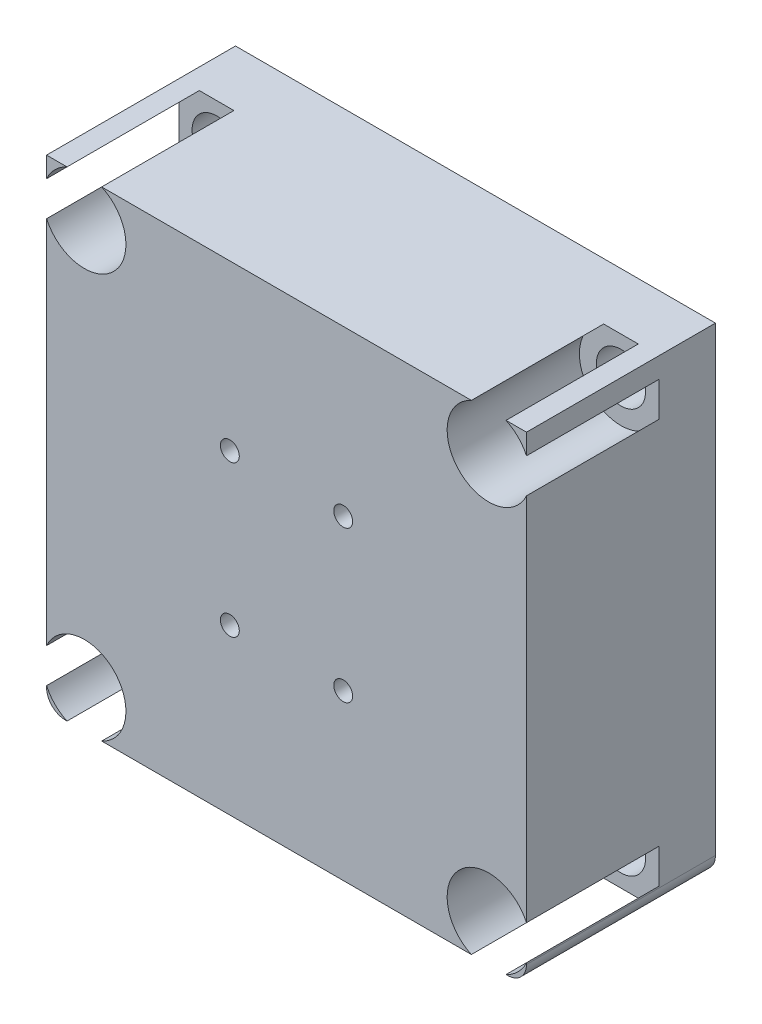
ISO-10303-21;
HEADER;
FILE_DESCRIPTION(('STEP AP214'),'2;1');
FILE_NAME('part.step','',(''),(''),'','','');
FILE_SCHEMA(('AUTOMOTIVE_DESIGN { 1 0 10303 214 1 1 1 1 }'));
ENDSEC;
DATA;
#1=APPLICATION_CONTEXT('core data for automotive mechanical design processes');
#2=APPLICATION_PROTOCOL_DEFINITION('international standard','automotive_design',2000,#1);
#3=PRODUCT_CONTEXT('',#1,'mechanical');
#4=PRODUCT('Part','Part','',(#3));
#5=PRODUCT_RELATED_PRODUCT_CATEGORY('part','',(#4));
#6=PRODUCT_DEFINITION_FORMATION('','',#4);
#7=PRODUCT_DEFINITION_CONTEXT('part definition',#1,'design');
#8=PRODUCT_DEFINITION('design','',#6,#7);
#9=PRODUCT_DEFINITION_SHAPE('','',#8);
#10=(LENGTH_UNIT() NAMED_UNIT(*) SI_UNIT(.MILLI.,.METRE.));
#11=(NAMED_UNIT(*) PLANE_ANGLE_UNIT() SI_UNIT($,.RADIAN.));
#12=(NAMED_UNIT(*) SI_UNIT($,.STERADIAN.) SOLID_ANGLE_UNIT());
#13=UNCERTAINTY_MEASURE_WITH_UNIT(LENGTH_MEASURE(1.E-05),#10,'distance_accuracy_value','');
#14=(GEOMETRIC_REPRESENTATION_CONTEXT(3) GLOBAL_UNCERTAINTY_ASSIGNED_CONTEXT((#13)) GLOBAL_UNIT_ASSIGNED_CONTEXT((#10,
#11,#12)) REPRESENTATION_CONTEXT('',''));
#15=CARTESIAN_POINT('',(0.,0.,0.));
#16=DIRECTION('',(0.,0.,1.));
#17=DIRECTION('',(1.,0.,0.));
#18=AXIS2_PLACEMENT_3D('',#15,#16,#17);
#19=CARTESIAN_POINT('',(-11.7,-11.7,10.));
#20=DIRECTION('',(0.,0.,1.));
#21=DIRECTION('',(1.,0.,0.));
#22=AXIS2_PLACEMENT_3D('',#19,#20,#21);
#23=PLANE('',#22);
#24=CARTESIAN_POINT('',(10.7,-10.7,10.));
#25=DIRECTION('',(0.,0.,1.));
#26=DIRECTION('',(1.,0.,0.));
#27=AXIS2_PLACEMENT_3D('',#24,#25,#26);
#28=CIRCLE('',#27,2.2);
#29=CARTESIAN_POINT('',(12.7,-9.78348486100883,10.));
#30=VERTEX_POINT('',#29);
#31=CARTESIAN_POINT('',(9.78348486100883,-12.7,10.));
#32=VERTEX_POINT('',#31);
#33=EDGE_CURVE('E187',#30,#32,#28,.T.);
#34=ORIENTED_EDGE('',*,*,#33,.F.);
#35=DIRECTION('',(0.,1.,0.));
#36=VECTOR('',#35,1.);
#37=CARTESIAN_POINT('',(12.7,-11.7,10.));
#38=LINE('',#37,#36);
#39=CARTESIAN_POINT('',(12.7,9.78348486100883,10.));
#40=VERTEX_POINT('',#39);
#41=EDGE_CURVE('E201',#30,#40,#38,.T.);
#42=ORIENTED_EDGE('',*,*,#41,.T.);
#43=CARTESIAN_POINT('',(10.7,10.7,10.));
#44=DIRECTION('',(0.,0.,1.));
#45=DIRECTION('',(1.,0.,0.));
#46=AXIS2_PLACEMENT_3D('',#43,#44,#45);
#47=CIRCLE('',#46,2.2);
#48=CARTESIAN_POINT('',(9.78348486100883,12.7,10.));
#49=VERTEX_POINT('',#48);
#50=EDGE_CURVE('E252',#49,#40,#47,.T.);
#51=ORIENTED_EDGE('',*,*,#50,.F.);
#52=DIRECTION('',(-1.,0.,0.));
#53=VECTOR('',#52,1.);
#54=CARTESIAN_POINT('',(12.7,12.7,10.));
#55=LINE('',#54,#53);
#56=CARTESIAN_POINT('',(-9.78348486100884,12.7,10.));
#57=VERTEX_POINT('',#56);
#58=EDGE_CURVE('E336',#49,#57,#55,.T.);
#59=ORIENTED_EDGE('',*,*,#58,.T.);
#60=CARTESIAN_POINT('',(-10.7,10.7,10.));
#61=DIRECTION('',(0.,0.,1.));
#62=DIRECTION('',(1.,0.,0.));
#63=AXIS2_PLACEMENT_3D('',#60,#61,#62);
#64=CIRCLE('',#63,2.2);
#65=CARTESIAN_POINT('',(-12.7,9.78348486100882,10.));
#66=VERTEX_POINT('',#65);
#67=EDGE_CURVE('E259',#66,#57,#64,.T.);
#68=ORIENTED_EDGE('',*,*,#67,.F.);
#69=DIRECTION('',(0.,-1.,0.));
#70=VECTOR('',#69,1.);
#71=CARTESIAN_POINT('',(-12.7,12.7,10.));
#72=LINE('',#71,#70);
#73=CARTESIAN_POINT('',(-12.7,-9.78348486100882,10.));
#74=VERTEX_POINT('',#73);
#75=EDGE_CURVE('E347',#66,#74,#72,.T.);
#76=ORIENTED_EDGE('',*,*,#75,.T.);
#77=CARTESIAN_POINT('',(-10.7,-10.7,10.));
#78=DIRECTION('',(0.,0.,1.));
#79=DIRECTION('',(1.,0.,0.));
#80=AXIS2_PLACEMENT_3D('',#77,#78,#79);
#81=CIRCLE('',#80,2.2);
#82=CARTESIAN_POINT('',(-9.78348486100882,-12.7,10.));
#83=VERTEX_POINT('',#82);
#84=EDGE_CURVE('E273',#83,#74,#81,.T.);
#85=ORIENTED_EDGE('',*,*,#84,.F.);
#86=DIRECTION('',(1.,0.,0.));
#87=VECTOR('',#86,1.);
#88=CARTESIAN_POINT('',(-11.7,-12.7,10.));
#89=LINE('',#88,#87);
#90=EDGE_CURVE('E204',#83,#32,#89,.T.);
#91=ORIENTED_EDGE('',*,*,#90,.T.);
#92=EDGE_LOOP('',(#34,#42,#51,#59,#68,#76,#85,#91));
#93=FACE_BOUND('',#92,.T.);
#94=CARTESIAN_POINT('',(3.,-4.,10.));
#95=DIRECTION('',(0.,0.,1.));
#96=DIRECTION('',(1.,0.,0.));
#97=AXIS2_PLACEMENT_3D('',#94,#95,#96);
#98=CIRCLE('',#97,0.499999999999999);
#99=CARTESIAN_POINT('',(3.5,-4.,10.));
#100=VERTEX_POINT('',#99);
#101=EDGE_CURVE('E522',#100,#100,#98,.T.);
#102=ORIENTED_EDGE('',*,*,#101,.F.);
#103=EDGE_LOOP('',(#102));
#104=FACE_BOUND('',#103,.T.);
#105=CARTESIAN_POINT('',(-3.,-4.,10.));
#106=DIRECTION('',(0.,0.,1.));
#107=DIRECTION('',(1.,0.,0.));
#108=AXIS2_PLACEMENT_3D('',#105,#106,#107);
#109=CIRCLE('',#108,0.499999999999999);
#110=CARTESIAN_POINT('',(-2.5,-4.,10.));
#111=VERTEX_POINT('',#110);
#112=EDGE_CURVE('E516',#111,#111,#109,.T.);
#113=ORIENTED_EDGE('',*,*,#112,.F.);
#114=EDGE_LOOP('',(#113));
#115=FACE_BOUND('',#114,.T.);
#116=CARTESIAN_POINT('',(-3.,4.,10.));
#117=DIRECTION('',(0.,0.,1.));
#118=DIRECTION('',(1.,0.,0.));
#119=AXIS2_PLACEMENT_3D('',#116,#117,#118);
#120=CIRCLE('',#119,0.499999999999999);
#121=CARTESIAN_POINT('',(-2.5,4.,10.));
#122=VERTEX_POINT('',#121);
#123=EDGE_CURVE('E508',#122,#122,#120,.T.);
#124=ORIENTED_EDGE('',*,*,#123,.F.);
#125=EDGE_LOOP('',(#124));
#126=FACE_BOUND('',#125,.T.);
#127=CARTESIAN_POINT('',(3.,4.,10.));
#128=DIRECTION('',(0.,0.,1.));
#129=DIRECTION('',(1.,0.,0.));
#130=AXIS2_PLACEMENT_3D('',#127,#128,#129);
#131=CIRCLE('',#130,0.499999999999999);
#132=CARTESIAN_POINT('',(3.5,4.,10.));
#133=VERTEX_POINT('',#132);
#134=EDGE_CURVE('E504',#133,#133,#131,.T.);
#135=ORIENTED_EDGE('',*,*,#134,.F.);
#136=EDGE_LOOP('',(#135));
#137=FACE_BOUND('',#136,.T.);
#138=ADVANCED_FACE('F33',(#93,#104,#115,#126,#137),#23,.T.);
#139=CARTESIAN_POINT('',(-12.7,-11.6165151389912,10.));
#140=VERTEX_POINT('',#139);
#141=CARTESIAN_POINT('',(-11.6165151389912,-12.7,10.));
#142=VERTEX_POINT('',#141);
#143=EDGE_CURVE('E276',#140,#142,#81,.T.);
#144=ORIENTED_EDGE('',*,*,#143,.F.);
#145=CARTESIAN_POINT('',(-12.7,-11.7,10.));
#146=VERTEX_POINT('',#145);
#147=EDGE_CURVE('E339',#140,#146,#72,.T.);
#148=ORIENTED_EDGE('',*,*,#147,.T.);
#149=CARTESIAN_POINT('',(-11.7,-11.7,10.));
#150=DIRECTION('',(0.,0.,1.));
#151=DIRECTION('',(1.,0.,0.));
#152=AXIS2_PLACEMENT_3D('',#149,#150,#151);
#153=CIRCLE('',#152,1.);
#154=CARTESIAN_POINT('',(-11.7,-12.7,10.));
#155=VERTEX_POINT('',#154);
#156=EDGE_CURVE('E346',#146,#155,#153,.T.);
#157=ORIENTED_EDGE('',*,*,#156,.T.);
#158=EDGE_CURVE('E296',#155,#142,#89,.T.);
#159=ORIENTED_EDGE('',*,*,#158,.T.);
#160=EDGE_LOOP('',(#144,#148,#157,#159));
#161=FACE_BOUND('',#160,.T.);
#162=ADVANCED_FACE('F352',(#161),#23,.T.);
#163=CARTESIAN_POINT('',(-11.6165151389912,12.7,10.));
#164=VERTEX_POINT('',#163);
#165=CARTESIAN_POINT('',(-12.7,11.6165151389912,10.));
#166=VERTEX_POINT('',#165);
#167=EDGE_CURVE('E264',#164,#166,#64,.T.);
#168=ORIENTED_EDGE('',*,*,#167,.F.);
#169=CARTESIAN_POINT('',(-12.7,12.7,10.));
#170=VERTEX_POINT('',#169);
#171=EDGE_CURVE('E234',#164,#170,#55,.T.);
#172=ORIENTED_EDGE('',*,*,#171,.T.);
#173=EDGE_CURVE('E343',#170,#166,#72,.T.);
#174=ORIENTED_EDGE('',*,*,#173,.T.);
#175=EDGE_LOOP('',(#168,#172,#174));
#176=FACE_BOUND('',#175,.T.);
#177=ADVANCED_FACE('F432',(#176),#23,.T.);
#178=CARTESIAN_POINT('',(12.7,11.6165151389912,10.));
#179=VERTEX_POINT('',#178);
#180=CARTESIAN_POINT('',(11.6165151389912,12.7,10.));
#181=VERTEX_POINT('',#180);
#182=EDGE_CURVE('E317',#179,#181,#47,.T.);
#183=ORIENTED_EDGE('',*,*,#182,.F.);
#184=CARTESIAN_POINT('',(12.7,12.7,10.));
#185=VERTEX_POINT('',#184);
#186=EDGE_CURVE('E212',#179,#185,#38,.T.);
#187=ORIENTED_EDGE('',*,*,#186,.T.);
#188=EDGE_CURVE('E312',#185,#181,#55,.T.);
#189=ORIENTED_EDGE('',*,*,#188,.T.);
#190=EDGE_LOOP('',(#183,#187,#189));
#191=FACE_BOUND('',#190,.T.);
#192=ADVANCED_FACE('F316',(#191),#23,.T.);
#193=CARTESIAN_POINT('',(12.7,12.7,10.));
#194=DIRECTION('',(0.,-1.,0.));
#195=DIRECTION('',(1.,0.,0.));
#196=AXIS2_PLACEMENT_3D('',#193,#194,#195);
#197=PLANE('',#196);
#198=DIRECTION('',(1.,0.,0.));
#199=VECTOR('',#198,1.);
#200=CARTESIAN_POINT('',(12.7,12.7,3.));
#201=LINE('',#200,#199);
#202=CARTESIAN_POINT('',(-11.6165151389912,12.7,3.));
#203=VERTEX_POINT('',#202);
#204=CARTESIAN_POINT('',(-9.78348486100884,12.7,3.));
#205=VERTEX_POINT('',#204);
#206=EDGE_CURVE('E263',#203,#205,#201,.T.);
#207=ORIENTED_EDGE('',*,*,#206,.T.);
#208=DIRECTION('',(0.,0.,1.));
#209=VECTOR('',#208,1.);
#210=CARTESIAN_POINT('',(-9.78348486100884,12.7,10.));
#211=LINE('',#210,#209);
#212=EDGE_CURVE('E267',#205,#57,#211,.T.);
#213=ORIENTED_EDGE('',*,*,#212,.T.);
#214=ORIENTED_EDGE('',*,*,#58,.F.);
#215=DIRECTION('',(0.,0.,1.));
#216=VECTOR('',#215,1.);
#217=CARTESIAN_POINT('',(9.78348486100883,12.7,10.));
#218=LINE('',#217,#216);
#219=CARTESIAN_POINT('',(9.78348486100883,12.7,3.));
#220=VERTEX_POINT('',#219);
#221=EDGE_CURVE('E332',#49,#220,#218,.F.);
#222=ORIENTED_EDGE('',*,*,#221,.T.);
#223=DIRECTION('',(1.,0.,0.));
#224=VECTOR('',#223,1.);
#225=CARTESIAN_POINT('',(12.7,12.7,3.));
#226=LINE('',#225,#224);
#227=CARTESIAN_POINT('',(11.6165151389912,12.7,3.));
#228=VERTEX_POINT('',#227);
#229=EDGE_CURVE('E525',#220,#228,#226,.T.);
#230=ORIENTED_EDGE('',*,*,#229,.T.);
#231=DIRECTION('',(0.,0.,1.));
#232=VECTOR('',#231,1.);
#233=CARTESIAN_POINT('',(11.6165151389912,12.7,10.));
#234=LINE('',#233,#232);
#235=EDGE_CURVE('E527',#228,#181,#234,.T.);
#236=ORIENTED_EDGE('',*,*,#235,.T.);
#237=ORIENTED_EDGE('',*,*,#188,.F.);
#238=DIRECTION('',(0.,0.,-1.));
#239=VECTOR('',#238,1.);
#240=CARTESIAN_POINT('',(12.7,12.7,10.));
#241=LINE('',#240,#239);
#242=CARTESIAN_POINT('',(12.7,12.7,0.));
#243=VERTEX_POINT('',#242);
#244=EDGE_CURVE('E215',#185,#243,#241,.T.);
#245=ORIENTED_EDGE('',*,*,#244,.T.);
#246=DIRECTION('',(-1.,0.,0.));
#247=VECTOR('',#246,1.);
#248=CARTESIAN_POINT('',(12.7,12.7,0.));
#249=LINE('',#248,#247);
#250=CARTESIAN_POINT('',(-12.7,12.7,0.));
#251=VERTEX_POINT('',#250);
#252=EDGE_CURVE('E220',#243,#251,#249,.T.);
#253=ORIENTED_EDGE('',*,*,#252,.T.);
#254=DIRECTION('',(0.,0.,-1.));
#255=VECTOR('',#254,1.);
#256=CARTESIAN_POINT('',(-12.7,12.7,10.));
#257=LINE('',#256,#255);
#258=EDGE_CURVE('E249',#170,#251,#257,.T.);
#259=ORIENTED_EDGE('',*,*,#258,.F.);
#260=ORIENTED_EDGE('',*,*,#171,.F.);
#261=DIRECTION('',(0.,0.,1.));
#262=VECTOR('',#261,1.);
#263=CARTESIAN_POINT('',(-11.6165151389912,12.7,10.));
#264=LINE('',#263,#262);
#265=EDGE_CURVE('E260',#164,#203,#264,.F.);
#266=ORIENTED_EDGE('',*,*,#265,.T.);
#267=EDGE_LOOP('',(#207,#213,#214,#222,#230,#236,#237,#245,#253,#259,#260,#266));
#268=FACE_BOUND('',#267,.T.);
#269=ADVANCED_FACE('F35',(#268),#197,.F.);
#270=CARTESIAN_POINT('',(-12.7,12.7,10.));
#271=DIRECTION('',(1.,0.,0.));
#272=DIRECTION('',(0.,0.,-1.));
#273=AXIS2_PLACEMENT_3D('',#270,#271,#272);
#274=PLANE('',#273);
#275=DIRECTION('',(0.,1.,0.));
#276=VECTOR('',#275,1.);
#277=CARTESIAN_POINT('',(-12.7,12.7,3.));
#278=LINE('',#277,#276);
#279=CARTESIAN_POINT('',(-12.7,-11.6165151389912,3.));
#280=VERTEX_POINT('',#279);
#281=CARTESIAN_POINT('',(-12.7,-9.78348486100882,3.));
#282=VERTEX_POINT('',#281);
#283=EDGE_CURVE('E282',#280,#282,#278,.T.);
#284=ORIENTED_EDGE('',*,*,#283,.T.);
#285=DIRECTION('',(0.,0.,1.));
#286=VECTOR('',#285,1.);
#287=CARTESIAN_POINT('',(-12.7,-9.78348486100882,10.));
#288=LINE('',#287,#286);
#289=EDGE_CURVE('E381',#282,#74,#288,.T.);
#290=ORIENTED_EDGE('',*,*,#289,.T.);
#291=ORIENTED_EDGE('',*,*,#75,.F.);
#292=DIRECTION('',(0.,0.,1.));
#293=VECTOR('',#292,1.);
#294=CARTESIAN_POINT('',(-12.7,9.78348486100882,10.));
#295=LINE('',#294,#293);
#296=CARTESIAN_POINT('',(-12.7,9.78348486100882,3.));
#297=VERTEX_POINT('',#296);
#298=EDGE_CURVE('E326',#66,#297,#295,.F.);
#299=ORIENTED_EDGE('',*,*,#298,.T.);
#300=DIRECTION('',(0.,1.,0.));
#301=VECTOR('',#300,1.);
#302=CARTESIAN_POINT('',(-12.7,12.7,3.));
#303=LINE('',#302,#301);
#304=CARTESIAN_POINT('',(-12.7,11.6165151389912,3.));
#305=VERTEX_POINT('',#304);
#306=EDGE_CURVE('E270',#297,#305,#303,.T.);
#307=ORIENTED_EDGE('',*,*,#306,.T.);
#308=DIRECTION('',(0.,0.,1.));
#309=VECTOR('',#308,1.);
#310=CARTESIAN_POINT('',(-12.7,11.6165151389912,10.));
#311=LINE('',#310,#309);
#312=EDGE_CURVE('E320',#305,#166,#311,.T.);
#313=ORIENTED_EDGE('',*,*,#312,.T.);
#314=ORIENTED_EDGE('',*,*,#173,.F.);
#315=ORIENTED_EDGE('',*,*,#258,.T.);
#316=DIRECTION('',(0.,-1.,0.));
#317=VECTOR('',#316,1.);
#318=CARTESIAN_POINT('',(-12.7,12.7,0.));
#319=LINE('',#318,#317);
#320=CARTESIAN_POINT('',(-12.7,-11.7,0.));
#321=VERTEX_POINT('',#320);
#322=EDGE_CURVE('E223',#251,#321,#319,.T.);
#323=ORIENTED_EDGE('',*,*,#322,.T.);
#324=DIRECTION('',(0.,0.,-1.));
#325=VECTOR('',#324,1.);
#326=CARTESIAN_POINT('',(-12.7,-11.7,10.));
#327=LINE('',#326,#325);
#328=EDGE_CURVE('E246',#146,#321,#327,.T.);
#329=ORIENTED_EDGE('',*,*,#328,.F.);
#330=ORIENTED_EDGE('',*,*,#147,.F.);
#331=DIRECTION('',(0.,0.,1.));
#332=VECTOR('',#331,1.);
#333=CARTESIAN_POINT('',(-12.7,-11.6165151389912,10.));
#334=LINE('',#333,#332);
#335=EDGE_CURVE('E379',#140,#280,#334,.F.);
#336=ORIENTED_EDGE('',*,*,#335,.T.);
#337=EDGE_LOOP('',(#284,#290,#291,#299,#307,#313,#314,#315,#323,#329,#330,#336));
#338=FACE_BOUND('',#337,.T.);
#339=ADVANCED_FACE('F398',(#338),#274,.F.);
#340=CARTESIAN_POINT('',(-11.7,-11.7,10.));
#341=DIRECTION('',(0.,0.,-1.));
#342=DIRECTION('',(-1.,0.,0.));
#343=AXIS2_PLACEMENT_3D('',#340,#341,#342);
#344=CYLINDRICAL_SURFACE('',#343,1.);
#345=CARTESIAN_POINT('',(-11.7,-11.7,0.));
#346=DIRECTION('',(0.,0.,1.));
#347=DIRECTION('',(1.,0.,0.));
#348=AXIS2_PLACEMENT_3D('',#345,#346,#347);
#349=CIRCLE('',#348,1.);
#350=CARTESIAN_POINT('',(-11.7,-12.7,0.));
#351=VERTEX_POINT('',#350);
#352=EDGE_CURVE('E226',#321,#351,#349,.T.);
#353=ORIENTED_EDGE('',*,*,#352,.T.);
#354=DIRECTION('',(0.,0.,-1.));
#355=VECTOR('',#354,1.);
#356=CARTESIAN_POINT('',(-11.7,-12.7,10.));
#357=LINE('',#356,#355);
#358=EDGE_CURVE('E243',#155,#351,#357,.T.);
#359=ORIENTED_EDGE('',*,*,#358,.F.);
#360=ORIENTED_EDGE('',*,*,#156,.F.);
#361=ORIENTED_EDGE('',*,*,#328,.T.);
#362=EDGE_LOOP('',(#353,#359,#360,#361));
#363=FACE_BOUND('',#362,.T.);
#364=ADVANCED_FACE('F405',(#363),#344,.T.);
#365=CARTESIAN_POINT('',(-11.7,-12.7,10.));
#366=DIRECTION('',(0.,1.,0.));
#367=DIRECTION('',(-1.,0.,0.));
#368=AXIS2_PLACEMENT_3D('',#365,#366,#367);
#369=PLANE('',#368);
#370=DIRECTION('',(-1.,0.,0.));
#371=VECTOR('',#370,1.);
#372=CARTESIAN_POINT('',(-11.7,-12.7,3.));
#373=LINE('',#372,#371);
#374=CARTESIAN_POINT('',(11.6165151389912,-12.7,3.));
#375=VERTEX_POINT('',#374);
#376=CARTESIAN_POINT('',(9.78348486100884,-12.7,3.));
#377=VERTEX_POINT('',#376);
#378=EDGE_CURVE('E11',#375,#377,#373,.T.);
#379=ORIENTED_EDGE('',*,*,#378,.T.);
#380=DIRECTION('',(0.,0.,1.));
#381=VECTOR('',#380,1.);
#382=CARTESIAN_POINT('',(9.78348486100883,-12.7,10.));
#383=LINE('',#382,#381);
#384=EDGE_CURVE('E373',#377,#32,#383,.T.);
#385=ORIENTED_EDGE('',*,*,#384,.T.);
#386=ORIENTED_EDGE('',*,*,#90,.F.);
#387=DIRECTION('',(0.,0.,1.));
#388=VECTOR('',#387,1.);
#389=CARTESIAN_POINT('',(-9.78348486100883,-12.7,10.));
#390=LINE('',#389,#388);
#391=CARTESIAN_POINT('',(-9.78348486100883,-12.7,3.));
#392=VERTEX_POINT('',#391);
#393=EDGE_CURVE('E56',#83,#392,#390,.F.);
#394=ORIENTED_EDGE('',*,*,#393,.T.);
#395=DIRECTION('',(-1.,0.,0.));
#396=VECTOR('',#395,1.);
#397=CARTESIAN_POINT('',(-11.7,-12.7,3.));
#398=LINE('',#397,#396);
#399=CARTESIAN_POINT('',(-11.6165151389912,-12.7,3.));
#400=VERTEX_POINT('',#399);
#401=EDGE_CURVE('E275',#392,#400,#398,.T.);
#402=ORIENTED_EDGE('',*,*,#401,.T.);
#403=DIRECTION('',(0.,0.,1.));
#404=VECTOR('',#403,1.);
#405=CARTESIAN_POINT('',(-11.6165151389912,-12.7,10.));
#406=LINE('',#405,#404);
#407=EDGE_CURVE('E279',#400,#142,#406,.T.);
#408=ORIENTED_EDGE('',*,*,#407,.T.);
#409=ORIENTED_EDGE('',*,*,#158,.F.);
#410=ORIENTED_EDGE('',*,*,#358,.T.);
#411=DIRECTION('',(1.,0.,0.));
#412=VECTOR('',#411,1.);
#413=CARTESIAN_POINT('',(-11.7,-12.7,0.));
#414=LINE('',#413,#412);
#415=CARTESIAN_POINT('',(11.7,-12.7,0.));
#416=VERTEX_POINT('',#415);
#417=EDGE_CURVE('E228',#351,#416,#414,.T.);
#418=ORIENTED_EDGE('',*,*,#417,.T.);
#419=DIRECTION('',(0.,0.,-1.));
#420=VECTOR('',#419,1.);
#421=CARTESIAN_POINT('',(11.7,-12.7,10.));
#422=LINE('',#421,#420);
#423=CARTESIAN_POINT('',(11.7,-12.7,10.));
#424=VERTEX_POINT('',#423);
#425=EDGE_CURVE('E240',#424,#416,#422,.T.);
#426=ORIENTED_EDGE('',*,*,#425,.F.);
#427=CARTESIAN_POINT('',(11.6165151389912,-12.7,10.));
#428=VERTEX_POINT('',#427);
#429=EDGE_CURVE('E293',#428,#424,#89,.T.);
#430=ORIENTED_EDGE('',*,*,#429,.F.);
#431=DIRECTION('',(0.,0.,1.));
#432=VECTOR('',#431,1.);
#433=CARTESIAN_POINT('',(11.6165151389912,-12.7,10.));
#434=LINE('',#433,#432);
#435=EDGE_CURVE('E48',#428,#375,#434,.F.);
#436=ORIENTED_EDGE('',*,*,#435,.T.);
#437=EDGE_LOOP('',(#379,#385,#386,#394,#402,#408,#409,#410,#418,#426,#430,#436));
#438=FACE_BOUND('',#437,.T.);
#439=ADVANCED_FACE('F357',(#438),#369,.F.);
#440=CARTESIAN_POINT('',(11.7,-11.7,10.));
#441=DIRECTION('',(0.,0.,-1.));
#442=DIRECTION('',(-1.,0.,0.));
#443=AXIS2_PLACEMENT_3D('',#440,#441,#442);
#444=CYLINDRICAL_SURFACE('',#443,1.);
#445=CARTESIAN_POINT('',(11.7,-11.7,0.));
#446=DIRECTION('',(0.,0.,1.));
#447=DIRECTION('',(1.,0.,0.));
#448=AXIS2_PLACEMENT_3D('',#445,#446,#447);
#449=CIRCLE('',#448,1.);
#450=CARTESIAN_POINT('',(12.7,-11.7,0.));
#451=VERTEX_POINT('',#450);
#452=EDGE_CURVE('E230',#416,#451,#449,.T.);
#453=ORIENTED_EDGE('',*,*,#452,.T.);
#454=DIRECTION('',(0.,0.,-1.));
#455=VECTOR('',#454,1.);
#456=CARTESIAN_POINT('',(12.7,-11.7,10.));
#457=LINE('',#456,#455);
#458=CARTESIAN_POINT('',(12.7,-11.7,10.));
#459=VERTEX_POINT('',#458);
#460=EDGE_CURVE('E237',#459,#451,#457,.T.);
#461=ORIENTED_EDGE('',*,*,#460,.F.);
#462=CARTESIAN_POINT('',(11.7,-11.7,10.));
#463=DIRECTION('',(0.,0.,1.));
#464=DIRECTION('',(1.,0.,0.));
#465=AXIS2_PLACEMENT_3D('',#462,#463,#464);
#466=CIRCLE('',#465,1.);
#467=EDGE_CURVE('E216',#424,#459,#466,.T.);
#468=ORIENTED_EDGE('',*,*,#467,.F.);
#469=ORIENTED_EDGE('',*,*,#425,.T.);
#470=EDGE_LOOP('',(#453,#461,#468,#469));
#471=FACE_BOUND('',#470,.T.);
#472=ADVANCED_FACE('F297',(#471),#444,.T.);
#473=CARTESIAN_POINT('',(12.7,-11.7,10.));
#474=DIRECTION('',(-1.,0.,0.));
#475=DIRECTION('',(0.,0.,1.));
#476=AXIS2_PLACEMENT_3D('',#473,#474,#475);
#477=PLANE('',#476);
#478=DIRECTION('',(0.,-1.,0.));
#479=VECTOR('',#478,1.);
#480=CARTESIAN_POINT('',(12.7,-11.7,3.));
#481=LINE('',#480,#479);
#482=CARTESIAN_POINT('',(12.7,-9.78348486100883,3.));
#483=VERTEX_POINT('',#482);
#484=CARTESIAN_POINT('',(12.7,-11.6165151389912,3.));
#485=VERTEX_POINT('',#484);
#486=EDGE_CURVE('E194',#483,#485,#481,.T.);
#487=ORIENTED_EDGE('',*,*,#486,.T.);
#488=DIRECTION('',(0.,0.,1.));
#489=VECTOR('',#488,1.);
#490=CARTESIAN_POINT('',(12.7,-11.6165151389912,10.));
#491=LINE('',#490,#489);
#492=CARTESIAN_POINT('',(12.7,-11.6165151389912,10.));
#493=VERTEX_POINT('',#492);
#494=EDGE_CURVE('E41',#485,#493,#491,.T.);
#495=ORIENTED_EDGE('',*,*,#494,.T.);
#496=EDGE_CURVE('E211',#459,#493,#38,.T.);
#497=ORIENTED_EDGE('',*,*,#496,.F.);
#498=ORIENTED_EDGE('',*,*,#460,.T.);
#499=DIRECTION('',(0.,1.,0.));
#500=VECTOR('',#499,1.);
#501=CARTESIAN_POINT('',(12.7,-11.7,0.));
#502=LINE('',#501,#500);
#503=EDGE_CURVE('E232',#451,#243,#502,.T.);
#504=ORIENTED_EDGE('',*,*,#503,.T.);
#505=ORIENTED_EDGE('',*,*,#244,.F.);
#506=ORIENTED_EDGE('',*,*,#186,.F.);
#507=DIRECTION('',(0.,0.,1.));
#508=VECTOR('',#507,1.);
#509=CARTESIAN_POINT('',(12.7,11.6165151389912,10.));
#510=LINE('',#509,#508);
#511=CARTESIAN_POINT('',(12.7,11.6165151389912,3.));
#512=VERTEX_POINT('',#511);
#513=EDGE_CURVE('E253',#179,#512,#510,.F.);
#514=ORIENTED_EDGE('',*,*,#513,.T.);
#515=DIRECTION('',(0.,-1.,0.));
#516=VECTOR('',#515,1.);
#517=CARTESIAN_POINT('',(12.7,-11.7,3.));
#518=LINE('',#517,#516);
#519=CARTESIAN_POINT('',(12.7,9.78348486100883,3.));
#520=VERTEX_POINT('',#519);
#521=EDGE_CURVE('E256',#512,#520,#518,.T.);
#522=ORIENTED_EDGE('',*,*,#521,.T.);
#523=DIRECTION('',(0.,0.,1.));
#524=VECTOR('',#523,1.);
#525=CARTESIAN_POINT('',(12.7,9.78348486100883,10.));
#526=LINE('',#525,#524);
#527=EDGE_CURVE('E210',#520,#40,#526,.T.);
#528=ORIENTED_EDGE('',*,*,#527,.T.);
#529=ORIENTED_EDGE('',*,*,#41,.F.);
#530=DIRECTION('',(0.,0.,1.));
#531=VECTOR('',#530,1.);
#532=CARTESIAN_POINT('',(12.7,-9.78348486100883,10.));
#533=LINE('',#532,#531);
#534=EDGE_CURVE('E184',#30,#483,#533,.F.);
#535=ORIENTED_EDGE('',*,*,#534,.T.);
#536=EDGE_LOOP('',(#487,#495,#497,#498,#504,#505,#506,#514,#522,#528,#529,#535));
#537=FACE_BOUND('',#536,.T.);
#538=ADVANCED_FACE('F208',(#537),#477,.F.);
#539=EDGE_CURVE('E195',#428,#493,#28,.T.);
#540=ORIENTED_EDGE('',*,*,#539,.F.);
#541=ORIENTED_EDGE('',*,*,#429,.T.);
#542=ORIENTED_EDGE('',*,*,#467,.T.);
#543=ORIENTED_EDGE('',*,*,#496,.T.);
#544=EDGE_LOOP('',(#540,#541,#542,#543));
#545=FACE_BOUND('',#544,.T.);
#546=ADVANCED_FACE('F289',(#545),#23,.T.);
#547=CARTESIAN_POINT('',(-11.7,-11.7,0.));
#548=DIRECTION('',(0.,0.,1.));
#549=DIRECTION('',(1.,0.,0.));
#550=AXIS2_PLACEMENT_3D('',#547,#548,#549);
#551=PLANE('',#550);
#552=CARTESIAN_POINT('',(10.7,-10.7,0.));
#553=DIRECTION('',(0.,0.,1.));
#554=DIRECTION('',(1.,0.,0.));
#555=AXIS2_PLACEMENT_3D('',#552,#553,#554);
#556=CIRCLE('',#555,1.3);
#557=CARTESIAN_POINT('',(12.,-10.7,0.));
#558=VERTEX_POINT('',#557);
#559=EDGE_CURVE('E406',#558,#558,#556,.T.);
#560=ORIENTED_EDGE('',*,*,#559,.T.);
#561=EDGE_LOOP('',(#560));
#562=FACE_BOUND('',#561,.T.);
#563=CARTESIAN_POINT('',(-10.7,-10.7,0.));
#564=DIRECTION('',(0.,0.,1.));
#565=DIRECTION('',(1.,0.,0.));
#566=AXIS2_PLACEMENT_3D('',#563,#564,#565);
#567=CIRCLE('',#566,1.3);
#568=CARTESIAN_POINT('',(-9.4,-10.7,0.));
#569=VERTEX_POINT('',#568);
#570=EDGE_CURVE('E371',#569,#569,#567,.T.);
#571=ORIENTED_EDGE('',*,*,#570,.T.);
#572=EDGE_LOOP('',(#571));
#573=FACE_BOUND('',#572,.T.);
#574=CARTESIAN_POINT('',(-10.7,10.7,0.));
#575=DIRECTION('',(0.,0.,1.));
#576=DIRECTION('',(1.,0.,0.));
#577=AXIS2_PLACEMENT_3D('',#574,#575,#576);
#578=CIRCLE('',#577,1.3);
#579=CARTESIAN_POINT('',(-9.4,10.7,0.));
#580=VERTEX_POINT('',#579);
#581=EDGE_CURVE('E392',#580,#580,#578,.T.);
#582=ORIENTED_EDGE('',*,*,#581,.T.);
#583=EDGE_LOOP('',(#582));
#584=FACE_BOUND('',#583,.T.);
#585=CARTESIAN_POINT('',(10.7,10.7,0.));
#586=DIRECTION('',(0.,0.,1.));
#587=DIRECTION('',(1.,0.,0.));
#588=AXIS2_PLACEMENT_3D('',#585,#586,#587);
#589=CIRCLE('',#588,1.3);
#590=CARTESIAN_POINT('',(12.,10.7,0.));
#591=VERTEX_POINT('',#590);
#592=EDGE_CURVE('E530',#591,#591,#589,.T.);
#593=ORIENTED_EDGE('',*,*,#592,.T.);
#594=EDGE_LOOP('',(#593));
#595=FACE_BOUND('',#594,.T.);
#596=CARTESIAN_POINT('',(3.,-4.,0.));
#597=DIRECTION('',(0.,0.,1.));
#598=DIRECTION('',(1.,0.,0.));
#599=AXIS2_PLACEMENT_3D('',#596,#597,#598);
#600=CIRCLE('',#599,0.499999999999998);
#601=CARTESIAN_POINT('',(3.5,-4.,0.));
#602=VERTEX_POINT('',#601);
#603=EDGE_CURVE('E519',#602,#602,#600,.T.);
#604=ORIENTED_EDGE('',*,*,#603,.T.);
#605=EDGE_LOOP('',(#604));
#606=FACE_BOUND('',#605,.T.);
#607=CARTESIAN_POINT('',(-3.,-4.,0.));
#608=DIRECTION('',(0.,0.,1.));
#609=DIRECTION('',(1.,0.,0.));
#610=AXIS2_PLACEMENT_3D('',#607,#608,#609);
#611=CIRCLE('',#610,0.499999999999998);
#612=CARTESIAN_POINT('',(-2.5,-4.,0.));
#613=VERTEX_POINT('',#612);
#614=EDGE_CURVE('E513',#613,#613,#611,.T.);
#615=ORIENTED_EDGE('',*,*,#614,.T.);
#616=EDGE_LOOP('',(#615));
#617=FACE_BOUND('',#616,.T.);
#618=CARTESIAN_POINT('',(-3.,4.,0.));
#619=DIRECTION('',(0.,0.,1.));
#620=DIRECTION('',(1.,0.,0.));
#621=AXIS2_PLACEMENT_3D('',#618,#619,#620);
#622=CIRCLE('',#621,0.499999999999998);
#623=CARTESIAN_POINT('',(-2.5,4.,0.));
#624=VERTEX_POINT('',#623);
#625=EDGE_CURVE('E506',#624,#624,#622,.T.);
#626=ORIENTED_EDGE('',*,*,#625,.T.);
#627=EDGE_LOOP('',(#626));
#628=FACE_BOUND('',#627,.T.);
#629=CARTESIAN_POINT('',(3.,4.,0.));
#630=DIRECTION('',(0.,0.,1.));
#631=DIRECTION('',(1.,0.,0.));
#632=AXIS2_PLACEMENT_3D('',#629,#630,#631);
#633=CIRCLE('',#632,0.499999999999998);
#634=CARTESIAN_POINT('',(3.5,4.,0.));
#635=VERTEX_POINT('',#634);
#636=EDGE_CURVE('E224',#635,#635,#633,.T.);
#637=ORIENTED_EDGE('',*,*,#636,.T.);
#638=EDGE_LOOP('',(#637));
#639=FACE_BOUND('',#638,.T.);
#640=ORIENTED_EDGE('',*,*,#252,.F.);
#641=ORIENTED_EDGE('',*,*,#503,.F.);
#642=ORIENTED_EDGE('',*,*,#452,.F.);
#643=ORIENTED_EDGE('',*,*,#417,.F.);
#644=ORIENTED_EDGE('',*,*,#352,.F.);
#645=ORIENTED_EDGE('',*,*,#322,.F.);
#646=EDGE_LOOP('',(#640,#641,#642,#643,#644,#645));
#647=FACE_BOUND('',#646,.T.);
#648=ADVANCED_FACE('F303',(#562,#573,#584,#595,#606,#617,#628,#639,#647),#551,.F.);
#649=CARTESIAN_POINT('',(3.,4.,10.));
#650=DIRECTION('',(0.,0.,1.));
#651=DIRECTION('',(1.,0.,0.));
#652=AXIS2_PLACEMENT_3D('',#649,#650,#651);
#653=CYLINDRICAL_SURFACE('',#652,0.499999999999999);
#654=ORIENTED_EDGE('',*,*,#636,.F.);
#655=EDGE_LOOP('',(#654));
#656=FACE_BOUND('',#655,.T.);
#657=ORIENTED_EDGE('',*,*,#134,.T.);
#658=EDGE_LOOP('',(#657));
#659=FACE_BOUND('',#658,.T.);
#660=ADVANCED_FACE('F440',(#656,#659),#653,.F.);
#661=CARTESIAN_POINT('',(-3.,4.,10.));
#662=DIRECTION('',(0.,0.,1.));
#663=DIRECTION('',(1.,0.,0.));
#664=AXIS2_PLACEMENT_3D('',#661,#662,#663);
#665=CYLINDRICAL_SURFACE('',#664,0.499999999999999);
#666=ORIENTED_EDGE('',*,*,#625,.F.);
#667=EDGE_LOOP('',(#666));
#668=FACE_BOUND('',#667,.T.);
#669=ORIENTED_EDGE('',*,*,#123,.T.);
#670=EDGE_LOOP('',(#669));
#671=FACE_BOUND('',#670,.T.);
#672=ADVANCED_FACE('F491',(#668,#671),#665,.F.);
#673=CARTESIAN_POINT('',(-3.,-4.,10.));
#674=DIRECTION('',(0.,0.,1.));
#675=DIRECTION('',(1.,0.,0.));
#676=AXIS2_PLACEMENT_3D('',#673,#674,#675);
#677=CYLINDRICAL_SURFACE('',#676,0.499999999999999);
#678=ORIENTED_EDGE('',*,*,#614,.F.);
#679=EDGE_LOOP('',(#678));
#680=FACE_BOUND('',#679,.T.);
#681=ORIENTED_EDGE('',*,*,#112,.T.);
#682=EDGE_LOOP('',(#681));
#683=FACE_BOUND('',#682,.T.);
#684=ADVANCED_FACE('F487',(#680,#683),#677,.F.);
#685=CARTESIAN_POINT('',(3.,-4.,10.));
#686=DIRECTION('',(0.,0.,1.));
#687=DIRECTION('',(1.,0.,0.));
#688=AXIS2_PLACEMENT_3D('',#685,#686,#687);
#689=CYLINDRICAL_SURFACE('',#688,0.499999999999999);
#690=ORIENTED_EDGE('',*,*,#603,.F.);
#691=EDGE_LOOP('',(#690));
#692=FACE_BOUND('',#691,.T.);
#693=ORIENTED_EDGE('',*,*,#101,.T.);
#694=EDGE_LOOP('',(#693));
#695=FACE_BOUND('',#694,.T.);
#696=ADVANCED_FACE('F482',(#692,#695),#689,.F.);
#697=CARTESIAN_POINT('',(12.,10.7,3.));
#698=DIRECTION('',(0.,0.,-1.));
#699=DIRECTION('',(-1.,0.,0.));
#700=AXIS2_PLACEMENT_3D('',#697,#698,#699);
#701=PLANE('',#700);
#702=CARTESIAN_POINT('',(10.7,10.7,3.));
#703=DIRECTION('',(0.,0.,1.));
#704=DIRECTION('',(1.,0.,0.));
#705=AXIS2_PLACEMENT_3D('',#702,#703,#704);
#706=CIRCLE('',#705,1.3);
#707=CARTESIAN_POINT('',(12.,10.7,3.));
#708=VERTEX_POINT('',#707);
#709=EDGE_CURVE('E533',#708,#708,#706,.T.);
#710=ORIENTED_EDGE('',*,*,#709,.F.);
#711=EDGE_LOOP('',(#710));
#712=FACE_BOUND('',#711,.T.);
#713=CARTESIAN_POINT('',(10.7,10.7,3.));
#714=DIRECTION('',(0.,0.,1.));
#715=DIRECTION('',(1.,0.,0.));
#716=AXIS2_PLACEMENT_3D('',#713,#714,#715);
#717=CIRCLE('',#716,2.2);
#718=EDGE_CURVE('E319',#220,#520,#717,.T.);
#719=ORIENTED_EDGE('',*,*,#718,.T.);
#720=ORIENTED_EDGE('',*,*,#521,.F.);
#721=EDGE_CURVE('E323',#512,#228,#717,.T.);
#722=ORIENTED_EDGE('',*,*,#721,.T.);
#723=ORIENTED_EDGE('',*,*,#229,.F.);
#724=EDGE_LOOP('',(#719,#720,#722,#723));
#725=FACE_BOUND('',#724,.T.);
#726=ADVANCED_FACE('F480',(#712,#725),#701,.F.);
#727=CARTESIAN_POINT('',(10.7,10.7,10.));
#728=DIRECTION('',(0.,0.,1.));
#729=DIRECTION('',(1.,0.,0.));
#730=AXIS2_PLACEMENT_3D('',#727,#728,#729);
#731=CYLINDRICAL_SURFACE('',#730,2.2);
#732=ORIENTED_EDGE('',*,*,#721,.F.);
#733=ORIENTED_EDGE('',*,*,#513,.F.);
#734=ORIENTED_EDGE('',*,*,#182,.T.);
#735=ORIENTED_EDGE('',*,*,#235,.F.);
#736=EDGE_LOOP('',(#732,#733,#734,#735));
#737=FACE_BOUND('',#736,.T.);
#738=ADVANCED_FACE('F477',(#737),#731,.F.);
#739=ORIENTED_EDGE('',*,*,#50,.T.);
#740=ORIENTED_EDGE('',*,*,#527,.F.);
#741=ORIENTED_EDGE('',*,*,#718,.F.);
#742=ORIENTED_EDGE('',*,*,#221,.F.);
#743=EDGE_LOOP('',(#739,#740,#741,#742));
#744=FACE_BOUND('',#743,.T.);
#745=ADVANCED_FACE('F329',(#744),#731,.F.);
#746=CARTESIAN_POINT('',(10.7,10.7,10.));
#747=DIRECTION('',(0.,0.,1.));
#748=DIRECTION('',(1.,0.,0.));
#749=AXIS2_PLACEMENT_3D('',#746,#747,#748);
#750=CYLINDRICAL_SURFACE('',#749,1.3);
#751=ORIENTED_EDGE('',*,*,#592,.F.);
#752=EDGE_LOOP('',(#751));
#753=FACE_BOUND('',#752,.T.);
#754=ORIENTED_EDGE('',*,*,#709,.T.);
#755=EDGE_LOOP('',(#754));
#756=FACE_BOUND('',#755,.T.);
#757=ADVANCED_FACE('F460',(#753,#756),#750,.F.);
#758=CARTESIAN_POINT('',(-9.4,10.7,3.));
#759=DIRECTION('',(0.,0.,-1.));
#760=DIRECTION('',(-1.,0.,0.));
#761=AXIS2_PLACEMENT_3D('',#758,#759,#760);
#762=PLANE('',#761);
#763=CARTESIAN_POINT('',(-10.7,10.7,3.));
#764=DIRECTION('',(0.,0.,1.));
#765=DIRECTION('',(1.,0.,0.));
#766=AXIS2_PLACEMENT_3D('',#763,#764,#765);
#767=CIRCLE('',#766,1.3);
#768=CARTESIAN_POINT('',(-9.4,10.7,3.));
#769=VERTEX_POINT('',#768);
#770=EDGE_CURVE('E389',#769,#769,#767,.T.);
#771=ORIENTED_EDGE('',*,*,#770,.F.);
#772=EDGE_LOOP('',(#771));
#773=FACE_BOUND('',#772,.T.);
#774=CARTESIAN_POINT('',(-10.7,10.7,3.));
#775=DIRECTION('',(0.,0.,1.));
#776=DIRECTION('',(1.,0.,0.));
#777=AXIS2_PLACEMENT_3D('',#774,#775,#776);
#778=CIRCLE('',#777,2.2);
#779=EDGE_CURVE('E384',#297,#205,#778,.T.);
#780=ORIENTED_EDGE('',*,*,#779,.T.);
#781=ORIENTED_EDGE('',*,*,#206,.F.);
#782=EDGE_CURVE('E388',#203,#305,#778,.T.);
#783=ORIENTED_EDGE('',*,*,#782,.T.);
#784=ORIENTED_EDGE('',*,*,#306,.F.);
#785=EDGE_LOOP('',(#780,#781,#783,#784));
#786=FACE_BOUND('',#785,.T.);
#787=ADVANCED_FACE('F458',(#773,#786),#762,.F.);
#788=CARTESIAN_POINT('',(-10.7,10.7,10.));
#789=DIRECTION('',(0.,0.,1.));
#790=DIRECTION('',(1.,0.,0.));
#791=AXIS2_PLACEMENT_3D('',#788,#789,#790);
#792=CYLINDRICAL_SURFACE('',#791,2.2);
#793=ORIENTED_EDGE('',*,*,#782,.F.);
#794=ORIENTED_EDGE('',*,*,#265,.F.);
#795=ORIENTED_EDGE('',*,*,#167,.T.);
#796=ORIENTED_EDGE('',*,*,#312,.F.);
#797=EDGE_LOOP('',(#793,#794,#795,#796));
#798=FACE_BOUND('',#797,.T.);
#799=ADVANCED_FACE('F455',(#798),#792,.F.);
#800=ORIENTED_EDGE('',*,*,#67,.T.);
#801=ORIENTED_EDGE('',*,*,#212,.F.);
#802=ORIENTED_EDGE('',*,*,#779,.F.);
#803=ORIENTED_EDGE('',*,*,#298,.F.);
#804=EDGE_LOOP('',(#800,#801,#802,#803));
#805=FACE_BOUND('',#804,.T.);
#806=ADVANCED_FACE('F402',(#805),#792,.F.);
#807=CARTESIAN_POINT('',(-10.7,10.7,10.));
#808=DIRECTION('',(0.,0.,1.));
#809=DIRECTION('',(1.,0.,0.));
#810=AXIS2_PLACEMENT_3D('',#807,#808,#809);
#811=CYLINDRICAL_SURFACE('',#810,1.3);
#812=ORIENTED_EDGE('',*,*,#581,.F.);
#813=EDGE_LOOP('',(#812));
#814=FACE_BOUND('',#813,.T.);
#815=ORIENTED_EDGE('',*,*,#770,.T.);
#816=EDGE_LOOP('',(#815));
#817=FACE_BOUND('',#816,.T.);
#818=ADVANCED_FACE('F473',(#814,#817),#811,.F.);
#819=CARTESIAN_POINT('',(-9.4,-10.7,3.));
#820=DIRECTION('',(0.,0.,-1.));
#821=DIRECTION('',(-1.,0.,0.));
#822=AXIS2_PLACEMENT_3D('',#819,#820,#821);
#823=PLANE('',#822);
#824=CARTESIAN_POINT('',(-10.7,-10.7,3.));
#825=DIRECTION('',(0.,0.,1.));
#826=DIRECTION('',(1.,0.,0.));
#827=AXIS2_PLACEMENT_3D('',#824,#825,#826);
#828=CIRCLE('',#827,1.3);
#829=CARTESIAN_POINT('',(-9.4,-10.7,3.));
#830=VERTEX_POINT('',#829);
#831=EDGE_CURVE('E367',#830,#830,#828,.T.);
#832=ORIENTED_EDGE('',*,*,#831,.F.);
#833=EDGE_LOOP('',(#832));
#834=FACE_BOUND('',#833,.T.);
#835=CARTESIAN_POINT('',(-10.7,-10.7,3.));
#836=DIRECTION('',(0.,0.,1.));
#837=DIRECTION('',(1.,0.,0.));
#838=AXIS2_PLACEMENT_3D('',#835,#836,#837);
#839=CIRCLE('',#838,2.2);
#840=EDGE_CURVE('E362',#280,#400,#839,.T.);
#841=ORIENTED_EDGE('',*,*,#840,.T.);
#842=ORIENTED_EDGE('',*,*,#401,.F.);
#843=EDGE_CURVE('E368',#392,#282,#839,.T.);
#844=ORIENTED_EDGE('',*,*,#843,.T.);
#845=ORIENTED_EDGE('',*,*,#283,.F.);
#846=EDGE_LOOP('',(#841,#842,#844,#845));
#847=FACE_BOUND('',#846,.T.);
#848=ADVANCED_FACE('F365',(#834,#847),#823,.F.);
#849=CARTESIAN_POINT('',(-10.7,-10.7,10.));
#850=DIRECTION('',(0.,0.,1.));
#851=DIRECTION('',(1.,0.,0.));
#852=AXIS2_PLACEMENT_3D('',#849,#850,#851);
#853=CYLINDRICAL_SURFACE('',#852,2.2);
#854=ORIENTED_EDGE('',*,*,#843,.F.);
#855=ORIENTED_EDGE('',*,*,#393,.F.);
#856=ORIENTED_EDGE('',*,*,#84,.T.);
#857=ORIENTED_EDGE('',*,*,#289,.F.);
#858=EDGE_LOOP('',(#854,#855,#856,#857));
#859=FACE_BOUND('',#858,.T.);
#860=ADVANCED_FACE('F621',(#859),#853,.F.);
#861=ORIENTED_EDGE('',*,*,#840,.F.);
#862=ORIENTED_EDGE('',*,*,#335,.F.);
#863=ORIENTED_EDGE('',*,*,#143,.T.);
#864=ORIENTED_EDGE('',*,*,#407,.F.);
#865=EDGE_LOOP('',(#861,#862,#863,#864));
#866=FACE_BOUND('',#865,.T.);
#867=ADVANCED_FACE('F361',(#866),#853,.F.);
#868=CARTESIAN_POINT('',(-10.7,-10.7,10.));
#869=DIRECTION('',(0.,0.,1.));
#870=DIRECTION('',(1.,0.,0.));
#871=AXIS2_PLACEMENT_3D('',#868,#869,#870);
#872=CYLINDRICAL_SURFACE('',#871,1.3);
#873=ORIENTED_EDGE('',*,*,#570,.F.);
#874=EDGE_LOOP('',(#873));
#875=FACE_BOUND('',#874,.T.);
#876=ORIENTED_EDGE('',*,*,#831,.T.);
#877=EDGE_LOOP('',(#876));
#878=FACE_BOUND('',#877,.T.);
#879=ADVANCED_FACE('F639',(#875,#878),#872,.F.);
#880=CARTESIAN_POINT('',(12.,-10.7,3.));
#881=DIRECTION('',(0.,0.,-1.));
#882=DIRECTION('',(-1.,0.,0.));
#883=AXIS2_PLACEMENT_3D('',#880,#881,#882);
#884=PLANE('',#883);
#885=CARTESIAN_POINT('',(10.7,-10.7,3.));
#886=DIRECTION('',(0.,0.,1.));
#887=DIRECTION('',(1.,0.,0.));
#888=AXIS2_PLACEMENT_3D('',#885,#886,#887);
#889=CIRCLE('',#888,1.3);
#890=CARTESIAN_POINT('',(12.,-10.7,3.));
#891=VERTEX_POINT('',#890);
#892=EDGE_CURVE('E409',#891,#891,#889,.T.);
#893=ORIENTED_EDGE('',*,*,#892,.F.);
#894=EDGE_LOOP('',(#893));
#895=FACE_BOUND('',#894,.T.);
#896=CARTESIAN_POINT('',(10.7,-10.7,3.));
#897=DIRECTION('',(0.,0.,1.));
#898=DIRECTION('',(1.,0.,0.));
#899=AXIS2_PLACEMENT_3D('',#896,#897,#898);
#900=CIRCLE('',#899,2.2);
#901=EDGE_CURVE('E205',#375,#485,#900,.T.);
#902=ORIENTED_EDGE('',*,*,#901,.T.);
#903=ORIENTED_EDGE('',*,*,#486,.F.);
#904=EDGE_CURVE('E190',#483,#377,#900,.T.);
#905=ORIENTED_EDGE('',*,*,#904,.T.);
#906=ORIENTED_EDGE('',*,*,#378,.F.);
#907=EDGE_LOOP('',(#902,#903,#905,#906));
#908=FACE_BOUND('',#907,.T.);
#909=ADVANCED_FACE('F415',(#895,#908),#884,.F.);
#910=CARTESIAN_POINT('',(10.7,-10.7,10.));
#911=DIRECTION('',(0.,0.,1.));
#912=DIRECTION('',(1.,0.,0.));
#913=AXIS2_PLACEMENT_3D('',#910,#911,#912);
#914=CYLINDRICAL_SURFACE('',#913,2.2);
#915=ORIENTED_EDGE('',*,*,#904,.F.);
#916=ORIENTED_EDGE('',*,*,#534,.F.);
#917=ORIENTED_EDGE('',*,*,#33,.T.);
#918=ORIENTED_EDGE('',*,*,#384,.F.);
#919=EDGE_LOOP('',(#915,#916,#917,#918));
#920=FACE_BOUND('',#919,.T.);
#921=ADVANCED_FACE('F186',(#920),#914,.F.);
#922=ORIENTED_EDGE('',*,*,#539,.T.);
#923=ORIENTED_EDGE('',*,*,#494,.F.);
#924=ORIENTED_EDGE('',*,*,#901,.F.);
#925=ORIENTED_EDGE('',*,*,#435,.F.);
#926=EDGE_LOOP('',(#922,#923,#924,#925));
#927=FACE_BOUND('',#926,.T.);
#928=ADVANCED_FACE('F416',(#927),#914,.F.);
#929=CARTESIAN_POINT('',(10.7,-10.7,10.));
#930=DIRECTION('',(0.,0.,1.));
#931=DIRECTION('',(1.,0.,0.));
#932=AXIS2_PLACEMENT_3D('',#929,#930,#931);
#933=CYLINDRICAL_SURFACE('',#932,1.3);
#934=ORIENTED_EDGE('',*,*,#559,.F.);
#935=EDGE_LOOP('',(#934));
#936=FACE_BOUND('',#935,.T.);
#937=ORIENTED_EDGE('',*,*,#892,.T.);
#938=EDGE_LOOP('',(#937));
#939=FACE_BOUND('',#938,.T.);
#940=ADVANCED_FACE('F418',(#936,#939),#933,.F.);
#941=CLOSED_SHELL('',(#138,#162,#177,#192,#269,#339,#364,#439,#472,#538,#546,#648,#660,#672,
#684,#696,#726,#738,#745,#757,#787,#799,#806,#818,#848,#860,#867,#879,#909,#921,#928,#940));
#942=MANIFOLD_SOLID_BREP('B2',#941);
#943=ADVANCED_BREP_SHAPE_REPRESENTATION('',(#18,#942),#14);
#944=SHAPE_DEFINITION_REPRESENTATION(#9,#943);
ENDSEC;
END-ISO-10303-21;
